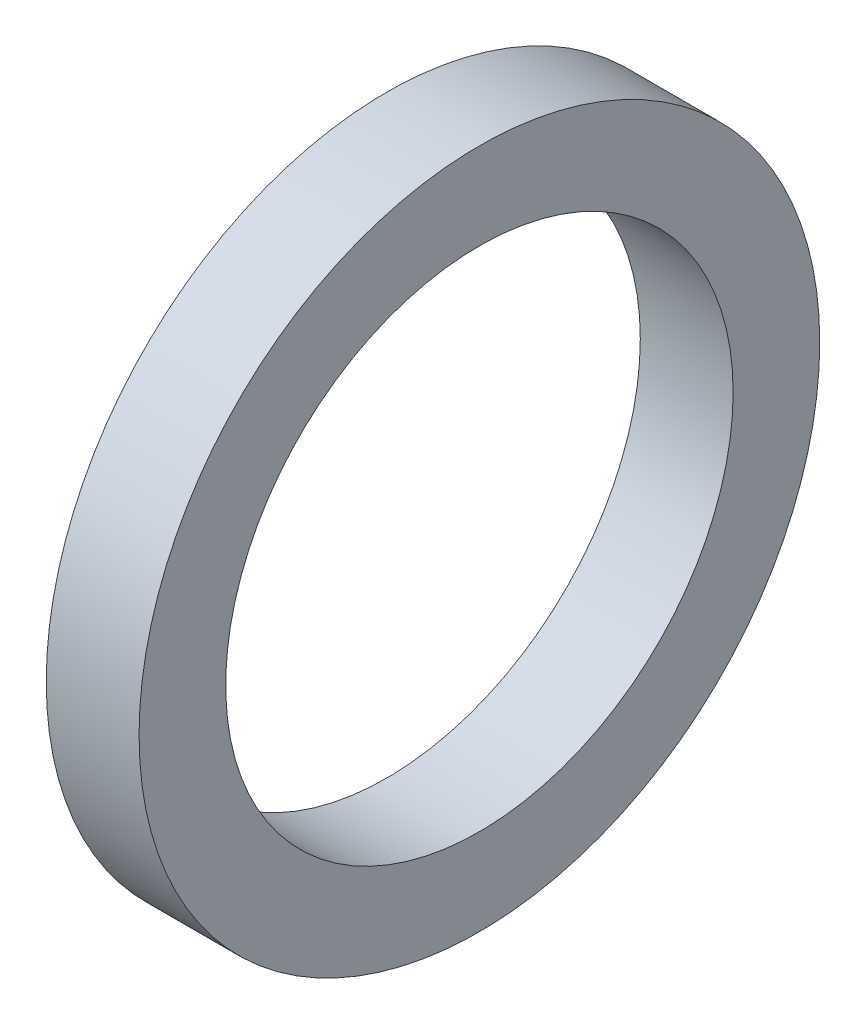
ISO-10303-21;
HEADER;
FILE_DESCRIPTION(('STEP AP214'),'2;1');
FILE_NAME('part.step','',(''),(''),'','','');
FILE_SCHEMA(('AUTOMOTIVE_DESIGN { 1 0 10303 214 1 1 1 1 }'));
ENDSEC;
DATA;
#1=APPLICATION_CONTEXT('core data for automotive mechanical design processes');
#2=APPLICATION_PROTOCOL_DEFINITION('international standard','automotive_design',2000,#1);
#3=PRODUCT_CONTEXT('',#1,'mechanical');
#4=PRODUCT('Part','Part','',(#3));
#5=PRODUCT_RELATED_PRODUCT_CATEGORY('part','',(#4));
#6=PRODUCT_DEFINITION_FORMATION('','',#4);
#7=PRODUCT_DEFINITION_CONTEXT('part definition',#1,'design');
#8=PRODUCT_DEFINITION('design','',#6,#7);
#9=PRODUCT_DEFINITION_SHAPE('','',#8);
#10=(LENGTH_UNIT() NAMED_UNIT(*) SI_UNIT(.MILLI.,.METRE.));
#11=(NAMED_UNIT(*) PLANE_ANGLE_UNIT() SI_UNIT($,.RADIAN.));
#12=(NAMED_UNIT(*) SI_UNIT($,.STERADIAN.) SOLID_ANGLE_UNIT());
#13=UNCERTAINTY_MEASURE_WITH_UNIT(LENGTH_MEASURE(1.E-05),#10,'distance_accuracy_value','');
#14=(GEOMETRIC_REPRESENTATION_CONTEXT(3) GLOBAL_UNCERTAINTY_ASSIGNED_CONTEXT((#13)) GLOBAL_UNIT_ASSIGNED_CONTEXT((#10,
#11,#12)) REPRESENTATION_CONTEXT('',''));
#15=CARTESIAN_POINT('',(0.,0.,0.));
#16=DIRECTION('',(0.,0.,1.));
#17=DIRECTION('',(1.,0.,0.));
#18=AXIS2_PLACEMENT_3D('',#15,#16,#17);
#19=CARTESIAN_POINT('',(1.5,0.,0.));
#20=DIRECTION('',(1.,0.,0.));
#21=DIRECTION('',(0.,0.,-1.));
#22=AXIS2_PLACEMENT_3D('',#19,#20,#21);
#23=PLANE('',#22);
#24=CARTESIAN_POINT('',(1.5,0.,0.));
#25=DIRECTION('',(1.,0.,0.));
#26=DIRECTION('',(0.,0.,-1.));
#27=AXIS2_PLACEMENT_3D('',#24,#25,#26);
#28=CIRCLE('',#27,5.5);
#29=CARTESIAN_POINT('',(1.5,0.,-5.5));
#30=VERTEX_POINT('',#29);
#31=EDGE_CURVE('E10',#30,#30,#28,.T.);
#32=ORIENTED_EDGE('',*,*,#31,.T.);
#33=EDGE_LOOP('',(#32));
#34=FACE_BOUND('',#33,.T.);
#35=CARTESIAN_POINT('',(1.5,0.,0.));
#36=DIRECTION('',(1.,0.,0.));
#37=DIRECTION('',(0.,0.,-1.));
#38=AXIS2_PLACEMENT_3D('',#35,#36,#37);
#39=CIRCLE('',#38,4.1);
#40=CARTESIAN_POINT('',(1.5,0.,-4.1));
#41=VERTEX_POINT('',#40);
#42=EDGE_CURVE('E56',#41,#41,#39,.T.);
#43=ORIENTED_EDGE('',*,*,#42,.F.);
#44=EDGE_LOOP('',(#43));
#45=FACE_BOUND('',#44,.T.);
#46=ADVANCED_FACE('F43',(#34,#45),#23,.T.);
#47=CARTESIAN_POINT('',(0.,0.,0.));
#48=DIRECTION('',(1.,0.,0.));
#49=DIRECTION('',(0.,0.,-1.));
#50=AXIS2_PLACEMENT_3D('',#47,#48,#49);
#51=PLANE('',#50);
#52=CARTESIAN_POINT('',(0.,0.,0.));
#53=DIRECTION('',(1.,0.,0.));
#54=DIRECTION('',(0.,0.,-1.));
#55=AXIS2_PLACEMENT_3D('',#52,#53,#54);
#56=CIRCLE('',#55,5.5);
#57=CARTESIAN_POINT('',(0.,0.,-5.5));
#58=VERTEX_POINT('',#57);
#59=EDGE_CURVE('E47',#58,#58,#56,.T.);
#60=ORIENTED_EDGE('',*,*,#59,.F.);
#61=EDGE_LOOP('',(#60));
#62=FACE_BOUND('',#61,.T.);
#63=CARTESIAN_POINT('',(0.,0.,0.));
#64=DIRECTION('',(1.,0.,0.));
#65=DIRECTION('',(0.,0.,-1.));
#66=AXIS2_PLACEMENT_3D('',#63,#64,#65);
#67=CIRCLE('',#66,4.1);
#68=CARTESIAN_POINT('',(0.,0.,-4.1));
#69=VERTEX_POINT('',#68);
#70=EDGE_CURVE('E58',#69,#69,#67,.T.);
#71=ORIENTED_EDGE('',*,*,#70,.T.);
#72=EDGE_LOOP('',(#71));
#73=FACE_BOUND('',#72,.T.);
#74=ADVANCED_FACE('F70',(#62,#73),#51,.F.);
#75=CARTESIAN_POINT('',(1.5,0.,0.));
#76=DIRECTION('',(-1.,0.,0.));
#77=DIRECTION('',(0.,0.,1.));
#78=AXIS2_PLACEMENT_3D('',#75,#76,#77);
#79=CYLINDRICAL_SURFACE('',#78,5.5);
#80=ORIENTED_EDGE('',*,*,#31,.F.);
#81=EDGE_LOOP('',(#80));
#82=FACE_BOUND('',#81,.T.);
#83=ORIENTED_EDGE('',*,*,#59,.T.);
#84=EDGE_LOOP('',(#83));
#85=FACE_BOUND('',#84,.T.);
#86=ADVANCED_FACE('F45',(#82,#85),#79,.T.);
#87=CARTESIAN_POINT('',(1.5,0.,0.));
#88=DIRECTION('',(-1.,0.,0.));
#89=DIRECTION('',(0.,0.,1.));
#90=AXIS2_PLACEMENT_3D('',#87,#88,#89);
#91=CYLINDRICAL_SURFACE('',#90,4.1);
#92=ORIENTED_EDGE('',*,*,#42,.T.);
#93=EDGE_LOOP('',(#92));
#94=FACE_BOUND('',#93,.T.);
#95=ORIENTED_EDGE('',*,*,#70,.F.);
#96=EDGE_LOOP('',(#95));
#97=FACE_BOUND('',#96,.T.);
#98=ADVANCED_FACE('F66',(#94,#97),#91,.F.);
#99=CLOSED_SHELL('',(#46,#74,#86,#98));
#100=MANIFOLD_SOLID_BREP('B2',#99);
#101=ADVANCED_BREP_SHAPE_REPRESENTATION('',(#18,#100),#14);
#102=SHAPE_DEFINITION_REPRESENTATION(#9,#101);
ENDSEC;
END-ISO-10303-21;
